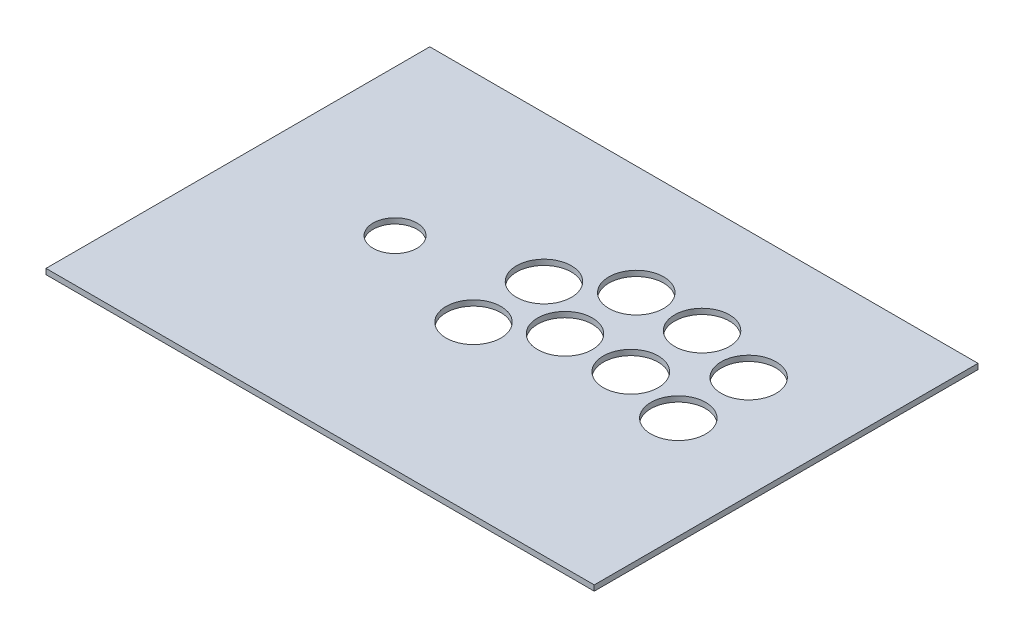
ISO-10303-21;
HEADER;
FILE_DESCRIPTION(('STEP AP214'),'2;1');
FILE_NAME('part.step','',(''),(''),'','','');
FILE_SCHEMA(('AUTOMOTIVE_DESIGN { 1 0 10303 214 1 1 1 1 }'));
ENDSEC;
DATA;
#1=APPLICATION_CONTEXT('core data for automotive mechanical design processes');
#2=APPLICATION_PROTOCOL_DEFINITION('international standard','automotive_design',2000,#1);
#3=PRODUCT_CONTEXT('',#1,'mechanical');
#4=PRODUCT('Part','Part','',(#3));
#5=PRODUCT_RELATED_PRODUCT_CATEGORY('part','',(#4));
#6=PRODUCT_DEFINITION_FORMATION('','',#4);
#7=PRODUCT_DEFINITION_CONTEXT('part definition',#1,'design');
#8=PRODUCT_DEFINITION('design','',#6,#7);
#9=PRODUCT_DEFINITION_SHAPE('','',#8);
#10=(LENGTH_UNIT() NAMED_UNIT(*) SI_UNIT(.MILLI.,.METRE.));
#11=(NAMED_UNIT(*) PLANE_ANGLE_UNIT() SI_UNIT($,.RADIAN.));
#12=(NAMED_UNIT(*) SI_UNIT($,.STERADIAN.) SOLID_ANGLE_UNIT());
#13=UNCERTAINTY_MEASURE_WITH_UNIT(LENGTH_MEASURE(1.E-05),#10,'distance_accuracy_value','');
#14=(GEOMETRIC_REPRESENTATION_CONTEXT(3) GLOBAL_UNCERTAINTY_ASSIGNED_CONTEXT((#13)) GLOBAL_UNIT_ASSIGNED_CONTEXT((#10,
#11,#12)) REPRESENTATION_CONTEXT('',''));
#15=CARTESIAN_POINT('',(0.,0.,0.));
#16=DIRECTION('',(0.,0.,1.));
#17=DIRECTION('',(1.,0.,0.));
#18=AXIS2_PLACEMENT_3D('',#15,#16,#17);
#19=CARTESIAN_POINT('',(0.,3.,0.));
#20=DIRECTION('',(0.,1.,0.));
#21=DIRECTION('',(0.,0.,1.));
#22=AXIS2_PLACEMENT_3D('',#19,#20,#21);
#23=PLANE('',#22);
#24=CARTESIAN_POINT('',(116.687224669604,3.,24.8912742443134));
#25=DIRECTION('',(0.,1.,0.));
#26=DIRECTION('',(0.,0.,1.));
#27=AXIS2_PLACEMENT_3D('',#24,#25,#26);
#28=CIRCLE('',#27,15.);
#29=CARTESIAN_POINT('',(116.687224669604,3.,39.8912742443134));
#30=VERTEX_POINT('',#29);
#31=EDGE_CURVE('E154',#30,#30,#28,.T.);
#32=ORIENTED_EDGE('',*,*,#31,.F.);
#33=EDGE_LOOP('',(#32));
#34=FACE_BOUND('',#33,.T.);
#35=CARTESIAN_POINT('',(45.6872246696035,3.,-23.1087257556866));
#36=DIRECTION('',(0.,1.,0.));
#37=DIRECTION('',(0.,0.,1.));
#38=AXIS2_PLACEMENT_3D('',#35,#36,#37);
#39=CIRCLE('',#38,15.);
#40=CARTESIAN_POINT('',(45.6872246696035,3.,-8.10872575568662));
#41=VERTEX_POINT('',#40);
#42=EDGE_CURVE('E142',#41,#41,#39,.T.);
#43=ORIENTED_EDGE('',*,*,#42,.F.);
#44=EDGE_LOOP('',(#43));
#45=FACE_BOUND('',#44,.T.);
#46=CARTESIAN_POINT('',(15.1716876548483,3.,35.4399424462805));
#47=DIRECTION('',(0.,1.,0.));
#48=DIRECTION('',(0.,0.,1.));
#49=AXIS2_PLACEMENT_3D('',#46,#47,#48);
#50=CIRCLE('',#49,15.0000000000001);
#51=CARTESIAN_POINT('',(15.1716876548483,3.,50.4399424462806));
#52=VERTEX_POINT('',#51);
#53=EDGE_CURVE('E130',#52,#52,#50,.T.);
#54=ORIENTED_EDGE('',*,*,#53,.F.);
#55=EDGE_LOOP('',(#54));
#56=FACE_BOUND('',#55,.T.);
#57=CARTESIAN_POINT('',(15.1716876548482,3.,-3.10872575568657));
#58=DIRECTION('',(0.,1.,0.));
#59=DIRECTION('',(0.,0.,1.));
#60=AXIS2_PLACEMENT_3D('',#57,#58,#59);
#61=CIRCLE('',#60,15.);
#62=CARTESIAN_POINT('',(15.1716876548482,3.,11.8912742443134));
#63=VERTEX_POINT('',#62);
#64=EDGE_CURVE('E118',#63,#63,#61,.T.);
#65=ORIENTED_EDGE('',*,*,#64,.F.);
#66=EDGE_LOOP('',(#65));
#67=FACE_BOUND('',#66,.T.);
#68=DIRECTION('',(0.,0.,1.));
#69=VECTOR('',#68,1.);
#70=CARTESIAN_POINT('',(-127.312775330396,3.,-83.1087257556866));
#71=LINE('',#70,#69);
#72=CARTESIAN_POINT('',(-127.312775330396,3.,-83.1087257556866));
#73=VERTEX_POINT('',#72);
#74=CARTESIAN_POINT('',(-127.312775330396,3.,126.891274244313));
#75=VERTEX_POINT('',#74);
#76=EDGE_CURVE('E88',#73,#75,#71,.T.);
#77=ORIENTED_EDGE('',*,*,#76,.T.);
#78=DIRECTION('',(1.,0.,0.));
#79=VECTOR('',#78,1.);
#80=CARTESIAN_POINT('',(-127.312775330396,3.,126.891274244313));
#81=LINE('',#80,#79);
#82=CARTESIAN_POINT('',(172.687224669604,3.,126.891274244313));
#83=VERTEX_POINT('',#82);
#84=EDGE_CURVE('E83',#75,#83,#81,.T.);
#85=ORIENTED_EDGE('',*,*,#84,.T.);
#86=DIRECTION('',(0.,0.,-1.));
#87=VECTOR('',#86,1.);
#88=CARTESIAN_POINT('',(172.687224669604,3.,-83.1087257556866));
#89=LINE('',#88,#87);
#90=CARTESIAN_POINT('',(172.687224669604,3.,-83.1087257556866));
#91=VERTEX_POINT('',#90);
#92=EDGE_CURVE('E86',#83,#91,#89,.T.);
#93=ORIENTED_EDGE('',*,*,#92,.T.);
#94=DIRECTION('',(-1.,0.,0.));
#95=VECTOR('',#94,1.);
#96=CARTESIAN_POINT('',(-127.312775330396,3.,-83.1087257556866));
#97=LINE('',#96,#95);
#98=EDGE_CURVE('E53',#91,#73,#97,.T.);
#99=ORIENTED_EDGE('',*,*,#98,.T.);
#100=EDGE_LOOP('',(#77,#85,#93,#99));
#101=FACE_BOUND('',#100,.T.);
#102=CARTESIAN_POINT('',(-47.3127753303965,3.,15.8912742443134));
#103=DIRECTION('',(0.,1.,0.));
#104=DIRECTION('',(0.,0.,1.));
#105=AXIS2_PLACEMENT_3D('',#102,#103,#104);
#106=CIRCLE('',#105,12.);
#107=CARTESIAN_POINT('',(-47.3127753303965,3.,27.8912742443134));
#108=VERTEX_POINT('',#107);
#109=EDGE_CURVE('E103',#108,#108,#106,.T.);
#110=ORIENTED_EDGE('',*,*,#109,.F.);
#111=EDGE_LOOP('',(#110));
#112=FACE_BOUND('',#111,.T.);
#113=CARTESIAN_POINT('',(81.6872246696035,3.,-23.1087257556866));
#114=DIRECTION('',(0.,1.,0.));
#115=DIRECTION('',(0.,0.,1.));
#116=AXIS2_PLACEMENT_3D('',#113,#114,#115);
#117=CIRCLE('',#116,15.);
#118=CARTESIAN_POINT('',(81.6872246696035,3.,-8.10872575568664));
#119=VERTEX_POINT('',#118);
#120=EDGE_CURVE('E124',#119,#119,#117,.T.);
#121=ORIENTED_EDGE('',*,*,#120,.F.);
#122=EDGE_LOOP('',(#121));
#123=FACE_BOUND('',#122,.T.);
#124=CARTESIAN_POINT('',(116.687224669604,3.,-13.6087257556866));
#125=DIRECTION('',(0.,1.,0.));
#126=DIRECTION('',(0.,0.,1.));
#127=AXIS2_PLACEMENT_3D('',#124,#125,#126);
#128=CIRCLE('',#127,15.);
#129=CARTESIAN_POINT('',(116.687224669604,3.,1.39127424431337));
#130=VERTEX_POINT('',#129);
#131=EDGE_CURVE('E136',#130,#130,#128,.T.);
#132=ORIENTED_EDGE('',*,*,#131,.F.);
#133=EDGE_LOOP('',(#132));
#134=FACE_BOUND('',#133,.T.);
#135=CARTESIAN_POINT('',(81.6872246696035,3.,15.8912742443133));
#136=DIRECTION('',(0.,1.,0.));
#137=DIRECTION('',(0.,0.,1.));
#138=AXIS2_PLACEMENT_3D('',#135,#136,#137);
#139=CIRCLE('',#138,15.0355695562208);
#140=CARTESIAN_POINT('',(81.6872246696035,3.,30.9268438005342));
#141=VERTEX_POINT('',#140);
#142=EDGE_CURVE('E148',#141,#141,#139,.T.);
#143=ORIENTED_EDGE('',*,*,#142,.F.);
#144=EDGE_LOOP('',(#143));
#145=FACE_BOUND('',#144,.T.);
#146=CARTESIAN_POINT('',(45.6872246696035,3.,15.8912742443133));
#147=DIRECTION('',(0.,1.,0.));
#148=DIRECTION('',(0.,0.,1.));
#149=AXIS2_PLACEMENT_3D('',#146,#147,#148);
#150=CIRCLE('',#149,15.);
#151=CARTESIAN_POINT('',(45.6872246696035,3.,30.8912742443133));
#152=VERTEX_POINT('',#151);
#153=EDGE_CURVE('E160',#152,#152,#150,.T.);
#154=ORIENTED_EDGE('',*,*,#153,.F.);
#155=EDGE_LOOP('',(#154));
#156=FACE_BOUND('',#155,.T.);
#157=ADVANCED_FACE('F36',(#34,#45,#56,#67,#101,#112,#123,#134,#145,#156),#23,.T.);
#158=CARTESIAN_POINT('',(0.,0.,0.));
#159=DIRECTION('',(0.,1.,0.));
#160=DIRECTION('',(0.,0.,1.));
#161=AXIS2_PLACEMENT_3D('',#158,#159,#160);
#162=PLANE('',#161);
#163=DIRECTION('',(0.,0.,1.));
#164=VECTOR('',#163,1.);
#165=CARTESIAN_POINT('',(-127.312775330396,0.,-83.1087257556866));
#166=LINE('',#165,#164);
#167=CARTESIAN_POINT('',(-127.312775330396,0.,-83.1087257556866));
#168=VERTEX_POINT('',#167);
#169=CARTESIAN_POINT('',(-127.312775330396,0.,126.891274244313));
#170=VERTEX_POINT('',#169);
#171=EDGE_CURVE('E100',#168,#170,#166,.T.);
#172=ORIENTED_EDGE('',*,*,#171,.F.);
#173=DIRECTION('',(-1.,0.,0.));
#174=VECTOR('',#173,1.);
#175=CARTESIAN_POINT('',(-127.312775330396,0.,-83.1087257556866));
#176=LINE('',#175,#174);
#177=CARTESIAN_POINT('',(172.687224669604,0.,-83.1087257556866));
#178=VERTEX_POINT('',#177);
#179=EDGE_CURVE('E76',#178,#168,#176,.T.);
#180=ORIENTED_EDGE('',*,*,#179,.F.);
#181=DIRECTION('',(0.,0.,-1.));
#182=VECTOR('',#181,1.);
#183=CARTESIAN_POINT('',(172.687224669604,0.,-83.1087257556866));
#184=LINE('',#183,#182);
#185=CARTESIAN_POINT('',(172.687224669604,0.,126.891274244313));
#186=VERTEX_POINT('',#185);
#187=EDGE_CURVE('E70',#186,#178,#184,.T.);
#188=ORIENTED_EDGE('',*,*,#187,.F.);
#189=DIRECTION('',(1.,0.,0.));
#190=VECTOR('',#189,1.);
#191=CARTESIAN_POINT('',(-127.312775330396,0.,126.891274244313));
#192=LINE('',#191,#190);
#193=EDGE_CURVE('E92',#170,#186,#192,.T.);
#194=ORIENTED_EDGE('',*,*,#193,.F.);
#195=EDGE_LOOP('',(#172,#180,#188,#194));
#196=FACE_BOUND('',#195,.T.);
#197=CARTESIAN_POINT('',(-47.3127753303965,0.,15.8912742443134));
#198=DIRECTION('',(0.,1.,0.));
#199=DIRECTION('',(0.,0.,1.));
#200=AXIS2_PLACEMENT_3D('',#197,#198,#199);
#201=CIRCLE('',#200,12.);
#202=CARTESIAN_POINT('',(-47.3127753303965,0.,27.8912742443134));
#203=VERTEX_POINT('',#202);
#204=EDGE_CURVE('E115',#203,#203,#201,.T.);
#205=ORIENTED_EDGE('',*,*,#204,.T.);
#206=EDGE_LOOP('',(#205));
#207=FACE_BOUND('',#206,.T.);
#208=CARTESIAN_POINT('',(15.1716876548482,0.,-3.10872575568657));
#209=DIRECTION('',(0.,1.,0.));
#210=DIRECTION('',(0.,0.,1.));
#211=AXIS2_PLACEMENT_3D('',#208,#209,#210);
#212=CIRCLE('',#211,15.);
#213=CARTESIAN_POINT('',(15.1716876548482,0.,11.8912742443134));
#214=VERTEX_POINT('',#213);
#215=EDGE_CURVE('E121',#214,#214,#212,.T.);
#216=ORIENTED_EDGE('',*,*,#215,.T.);
#217=EDGE_LOOP('',(#216));
#218=FACE_BOUND('',#217,.T.);
#219=CARTESIAN_POINT('',(81.6872246696035,0.,-23.1087257556866));
#220=DIRECTION('',(0.,1.,0.));
#221=DIRECTION('',(0.,0.,1.));
#222=AXIS2_PLACEMENT_3D('',#219,#220,#221);
#223=CIRCLE('',#222,15.);
#224=CARTESIAN_POINT('',(81.6872246696035,0.,-8.10872575568664));
#225=VERTEX_POINT('',#224);
#226=EDGE_CURVE('E127',#225,#225,#223,.T.);
#227=ORIENTED_EDGE('',*,*,#226,.T.);
#228=EDGE_LOOP('',(#227));
#229=FACE_BOUND('',#228,.T.);
#230=CARTESIAN_POINT('',(15.1716876548483,0.,35.4399424462805));
#231=DIRECTION('',(0.,1.,0.));
#232=DIRECTION('',(0.,0.,1.));
#233=AXIS2_PLACEMENT_3D('',#230,#231,#232);
#234=CIRCLE('',#233,15.0000000000001);
#235=CARTESIAN_POINT('',(15.1716876548483,0.,50.4399424462806));
#236=VERTEX_POINT('',#235);
#237=EDGE_CURVE('E133',#236,#236,#234,.T.);
#238=ORIENTED_EDGE('',*,*,#237,.T.);
#239=EDGE_LOOP('',(#238));
#240=FACE_BOUND('',#239,.T.);
#241=CARTESIAN_POINT('',(116.687224669604,0.,-13.6087257556866));
#242=DIRECTION('',(0.,1.,0.));
#243=DIRECTION('',(0.,0.,1.));
#244=AXIS2_PLACEMENT_3D('',#241,#242,#243);
#245=CIRCLE('',#244,15.);
#246=CARTESIAN_POINT('',(116.687224669604,0.,1.39127424431337));
#247=VERTEX_POINT('',#246);
#248=EDGE_CURVE('E139',#247,#247,#245,.T.);
#249=ORIENTED_EDGE('',*,*,#248,.T.);
#250=EDGE_LOOP('',(#249));
#251=FACE_BOUND('',#250,.T.);
#252=CARTESIAN_POINT('',(45.6872246696035,0.,-23.1087257556866));
#253=DIRECTION('',(0.,1.,0.));
#254=DIRECTION('',(0.,0.,1.));
#255=AXIS2_PLACEMENT_3D('',#252,#253,#254);
#256=CIRCLE('',#255,15.);
#257=CARTESIAN_POINT('',(45.6872246696035,0.,-8.10872575568662));
#258=VERTEX_POINT('',#257);
#259=EDGE_CURVE('E145',#258,#258,#256,.T.);
#260=ORIENTED_EDGE('',*,*,#259,.T.);
#261=EDGE_LOOP('',(#260));
#262=FACE_BOUND('',#261,.T.);
#263=CARTESIAN_POINT('',(81.6872246696035,0.,15.8912742443133));
#264=DIRECTION('',(0.,1.,0.));
#265=DIRECTION('',(0.,0.,1.));
#266=AXIS2_PLACEMENT_3D('',#263,#264,#265);
#267=CIRCLE('',#266,15.0355695562208);
#268=CARTESIAN_POINT('',(81.6872246696035,0.,30.9268438005342));
#269=VERTEX_POINT('',#268);
#270=EDGE_CURVE('E151',#269,#269,#267,.T.);
#271=ORIENTED_EDGE('',*,*,#270,.T.);
#272=EDGE_LOOP('',(#271));
#273=FACE_BOUND('',#272,.T.);
#274=CARTESIAN_POINT('',(116.687224669604,0.,24.8912742443134));
#275=DIRECTION('',(0.,1.,0.));
#276=DIRECTION('',(0.,0.,1.));
#277=AXIS2_PLACEMENT_3D('',#274,#275,#276);
#278=CIRCLE('',#277,15.);
#279=CARTESIAN_POINT('',(116.687224669604,0.,39.8912742443134));
#280=VERTEX_POINT('',#279);
#281=EDGE_CURVE('E157',#280,#280,#278,.T.);
#282=ORIENTED_EDGE('',*,*,#281,.T.);
#283=EDGE_LOOP('',(#282));
#284=FACE_BOUND('',#283,.T.);
#285=CARTESIAN_POINT('',(45.6872246696035,0.,15.8912742443133));
#286=DIRECTION('',(0.,1.,0.));
#287=DIRECTION('',(0.,0.,1.));
#288=AXIS2_PLACEMENT_3D('',#285,#286,#287);
#289=CIRCLE('',#288,15.);
#290=CARTESIAN_POINT('',(45.6872246696035,0.,30.8912742443133));
#291=VERTEX_POINT('',#290);
#292=EDGE_CURVE('E163',#291,#291,#289,.T.);
#293=ORIENTED_EDGE('',*,*,#292,.T.);
#294=EDGE_LOOP('',(#293));
#295=FACE_BOUND('',#294,.T.);
#296=ADVANCED_FACE('F111',(#196,#207,#218,#229,#240,#251,#262,#273,#284,#295),#162,.F.);
#297=CARTESIAN_POINT('',(-127.312775330396,3.,-83.1087257556866));
#298=DIRECTION('',(1.,0.,0.));
#299=DIRECTION('',(0.,0.,-1.));
#300=AXIS2_PLACEMENT_3D('',#297,#298,#299);
#301=PLANE('',#300);
#302=ORIENTED_EDGE('',*,*,#171,.T.);
#303=DIRECTION('',(0.,-1.,0.));
#304=VECTOR('',#303,1.);
#305=CARTESIAN_POINT('',(-127.312775330396,3.,126.891274244313));
#306=LINE('',#305,#304);
#307=EDGE_CURVE('E11',#75,#170,#306,.T.);
#308=ORIENTED_EDGE('',*,*,#307,.F.);
#309=ORIENTED_EDGE('',*,*,#76,.F.);
#310=DIRECTION('',(0.,-1.,0.));
#311=VECTOR('',#310,1.);
#312=CARTESIAN_POINT('',(-127.312775330396,3.,-83.1087257556866));
#313=LINE('',#312,#311);
#314=EDGE_CURVE('E96',#73,#168,#313,.T.);
#315=ORIENTED_EDGE('',*,*,#314,.T.);
#316=EDGE_LOOP('',(#302,#308,#309,#315));
#317=FACE_BOUND('',#316,.T.);
#318=ADVANCED_FACE('F38',(#317),#301,.F.);
#319=CARTESIAN_POINT('',(-127.312775330396,3.,126.891274244313));
#320=DIRECTION('',(0.,0.,-1.));
#321=DIRECTION('',(-1.,0.,0.));
#322=AXIS2_PLACEMENT_3D('',#319,#320,#321);
#323=PLANE('',#322);
#324=ORIENTED_EDGE('',*,*,#193,.T.);
#325=DIRECTION('',(0.,-1.,0.));
#326=VECTOR('',#325,1.);
#327=CARTESIAN_POINT('',(172.687224669604,3.,126.891274244313));
#328=LINE('',#327,#326);
#329=EDGE_CURVE('E45',#83,#186,#328,.T.);
#330=ORIENTED_EDGE('',*,*,#329,.F.);
#331=ORIENTED_EDGE('',*,*,#84,.F.);
#332=ORIENTED_EDGE('',*,*,#307,.T.);
#333=EDGE_LOOP('',(#324,#330,#331,#332));
#334=FACE_BOUND('',#333,.T.);
#335=ADVANCED_FACE('F91',(#334),#323,.F.);
#336=CARTESIAN_POINT('',(172.687224669604,3.,-83.1087257556866));
#337=DIRECTION('',(-1.,0.,0.));
#338=DIRECTION('',(0.,0.,1.));
#339=AXIS2_PLACEMENT_3D('',#336,#337,#338);
#340=PLANE('',#339);
#341=ORIENTED_EDGE('',*,*,#187,.T.);
#342=DIRECTION('',(0.,-1.,0.));
#343=VECTOR('',#342,1.);
#344=CARTESIAN_POINT('',(172.687224669604,3.,-83.1087257556866));
#345=LINE('',#344,#343);
#346=EDGE_CURVE('E93',#91,#178,#345,.T.);
#347=ORIENTED_EDGE('',*,*,#346,.F.);
#348=ORIENTED_EDGE('',*,*,#92,.F.);
#349=ORIENTED_EDGE('',*,*,#329,.T.);
#350=EDGE_LOOP('',(#341,#347,#348,#349));
#351=FACE_BOUND('',#350,.T.);
#352=ADVANCED_FACE('F94',(#351),#340,.F.);
#353=CARTESIAN_POINT('',(-127.312775330396,3.,-83.1087257556866));
#354=DIRECTION('',(0.,0.,1.));
#355=DIRECTION('',(1.,0.,0.));
#356=AXIS2_PLACEMENT_3D('',#353,#354,#355);
#357=PLANE('',#356);
#358=ORIENTED_EDGE('',*,*,#179,.T.);
#359=ORIENTED_EDGE('',*,*,#314,.F.);
#360=ORIENTED_EDGE('',*,*,#98,.F.);
#361=ORIENTED_EDGE('',*,*,#346,.T.);
#362=EDGE_LOOP('',(#358,#359,#360,#361));
#363=FACE_BOUND('',#362,.T.);
#364=ADVANCED_FACE('F108',(#363),#357,.F.);
#365=CARTESIAN_POINT('',(-47.3127753303965,3.,15.8912742443134));
#366=DIRECTION('',(0.,-1.,0.));
#367=DIRECTION('',(0.,0.,-1.));
#368=AXIS2_PLACEMENT_3D('',#365,#366,#367);
#369=CYLINDRICAL_SURFACE('',#368,12.);
#370=ORIENTED_EDGE('',*,*,#109,.T.);
#371=EDGE_LOOP('',(#370));
#372=FACE_BOUND('',#371,.T.);
#373=ORIENTED_EDGE('',*,*,#204,.F.);
#374=EDGE_LOOP('',(#373));
#375=FACE_BOUND('',#374,.T.);
#376=ADVANCED_FACE('F182',(#372,#375),#369,.F.);
#377=CARTESIAN_POINT('',(15.1716876548482,3.,-3.10872575568657));
#378=DIRECTION('',(0.,-1.,0.));
#379=DIRECTION('',(0.,0.,-1.));
#380=AXIS2_PLACEMENT_3D('',#377,#378,#379);
#381=CYLINDRICAL_SURFACE('',#380,15.);
#382=ORIENTED_EDGE('',*,*,#64,.T.);
#383=EDGE_LOOP('',(#382));
#384=FACE_BOUND('',#383,.T.);
#385=ORIENTED_EDGE('',*,*,#215,.F.);
#386=EDGE_LOOP('',(#385));
#387=FACE_BOUND('',#386,.T.);
#388=ADVANCED_FACE('F228',(#384,#387),#381,.F.);
#389=CARTESIAN_POINT('',(81.6872246696035,3.,-23.1087257556866));
#390=DIRECTION('',(0.,-1.,0.));
#391=DIRECTION('',(0.,0.,-1.));
#392=AXIS2_PLACEMENT_3D('',#389,#390,#391);
#393=CYLINDRICAL_SURFACE('',#392,15.);
#394=ORIENTED_EDGE('',*,*,#120,.T.);
#395=EDGE_LOOP('',(#394));
#396=FACE_BOUND('',#395,.T.);
#397=ORIENTED_EDGE('',*,*,#226,.F.);
#398=EDGE_LOOP('',(#397));
#399=FACE_BOUND('',#398,.T.);
#400=ADVANCED_FACE('F236',(#396,#399),#393,.F.);
#401=CARTESIAN_POINT('',(15.1716876548483,3.,35.4399424462805));
#402=DIRECTION('',(0.,-1.,0.));
#403=DIRECTION('',(0.,0.,-1.));
#404=AXIS2_PLACEMENT_3D('',#401,#402,#403);
#405=CYLINDRICAL_SURFACE('',#404,15.0000000000001);
#406=ORIENTED_EDGE('',*,*,#53,.T.);
#407=EDGE_LOOP('',(#406));
#408=FACE_BOUND('',#407,.T.);
#409=ORIENTED_EDGE('',*,*,#237,.F.);
#410=EDGE_LOOP('',(#409));
#411=FACE_BOUND('',#410,.T.);
#412=ADVANCED_FACE('F244',(#408,#411),#405,.F.);
#413=CARTESIAN_POINT('',(116.687224669604,3.,-13.6087257556866));
#414=DIRECTION('',(0.,-1.,0.));
#415=DIRECTION('',(0.,0.,-1.));
#416=AXIS2_PLACEMENT_3D('',#413,#414,#415);
#417=CYLINDRICAL_SURFACE('',#416,15.);
#418=ORIENTED_EDGE('',*,*,#131,.T.);
#419=EDGE_LOOP('',(#418));
#420=FACE_BOUND('',#419,.T.);
#421=ORIENTED_EDGE('',*,*,#248,.F.);
#422=EDGE_LOOP('',(#421));
#423=FACE_BOUND('',#422,.T.);
#424=ADVANCED_FACE('F253',(#420,#423),#417,.F.);
#425=CARTESIAN_POINT('',(45.6872246696035,3.,-23.1087257556866));
#426=DIRECTION('',(0.,-1.,0.));
#427=DIRECTION('',(0.,0.,-1.));
#428=AXIS2_PLACEMENT_3D('',#425,#426,#427);
#429=CYLINDRICAL_SURFACE('',#428,15.);
#430=ORIENTED_EDGE('',*,*,#42,.T.);
#431=EDGE_LOOP('',(#430));
#432=FACE_BOUND('',#431,.T.);
#433=ORIENTED_EDGE('',*,*,#259,.F.);
#434=EDGE_LOOP('',(#433));
#435=FACE_BOUND('',#434,.T.);
#436=ADVANCED_FACE('F262',(#432,#435),#429,.F.);
#437=CARTESIAN_POINT('',(81.6872246696035,3.,15.8912742443133));
#438=DIRECTION('',(0.,-1.,0.));
#439=DIRECTION('',(0.,0.,-1.));
#440=AXIS2_PLACEMENT_3D('',#437,#438,#439);
#441=CYLINDRICAL_SURFACE('',#440,15.0355695562208);
#442=ORIENTED_EDGE('',*,*,#142,.T.);
#443=EDGE_LOOP('',(#442));
#444=FACE_BOUND('',#443,.T.);
#445=ORIENTED_EDGE('',*,*,#270,.F.);
#446=EDGE_LOOP('',(#445));
#447=FACE_BOUND('',#446,.T.);
#448=ADVANCED_FACE('F271',(#444,#447),#441,.F.);
#449=CARTESIAN_POINT('',(116.687224669604,3.,24.8912742443134));
#450=DIRECTION('',(0.,-1.,0.));
#451=DIRECTION('',(0.,0.,-1.));
#452=AXIS2_PLACEMENT_3D('',#449,#450,#451);
#453=CYLINDRICAL_SURFACE('',#452,15.);
#454=ORIENTED_EDGE('',*,*,#31,.T.);
#455=EDGE_LOOP('',(#454));
#456=FACE_BOUND('',#455,.T.);
#457=ORIENTED_EDGE('',*,*,#281,.F.);
#458=EDGE_LOOP('',(#457));
#459=FACE_BOUND('',#458,.T.);
#460=ADVANCED_FACE('F280',(#456,#459),#453,.F.);
#461=CARTESIAN_POINT('',(45.6872246696035,3.,15.8912742443133));
#462=DIRECTION('',(0.,-1.,0.));
#463=DIRECTION('',(0.,0.,-1.));
#464=AXIS2_PLACEMENT_3D('',#461,#462,#463);
#465=CYLINDRICAL_SURFACE('',#464,15.);
#466=ORIENTED_EDGE('',*,*,#153,.T.);
#467=EDGE_LOOP('',(#466));
#468=FACE_BOUND('',#467,.T.);
#469=ORIENTED_EDGE('',*,*,#292,.F.);
#470=EDGE_LOOP('',(#469));
#471=FACE_BOUND('',#470,.T.);
#472=ADVANCED_FACE('F169',(#468,#471),#465,.F.);
#473=CLOSED_SHELL('',(#157,#296,#318,#335,#352,#364,#376,#388,#400,#412,#424,#436,#448,#460,#472));
#474=MANIFOLD_SOLID_BREP('B2',#473);
#475=ADVANCED_BREP_SHAPE_REPRESENTATION('',(#18,#474),#14);
#476=SHAPE_DEFINITION_REPRESENTATION(#9,#475);
ENDSEC;
END-ISO-10303-21;
